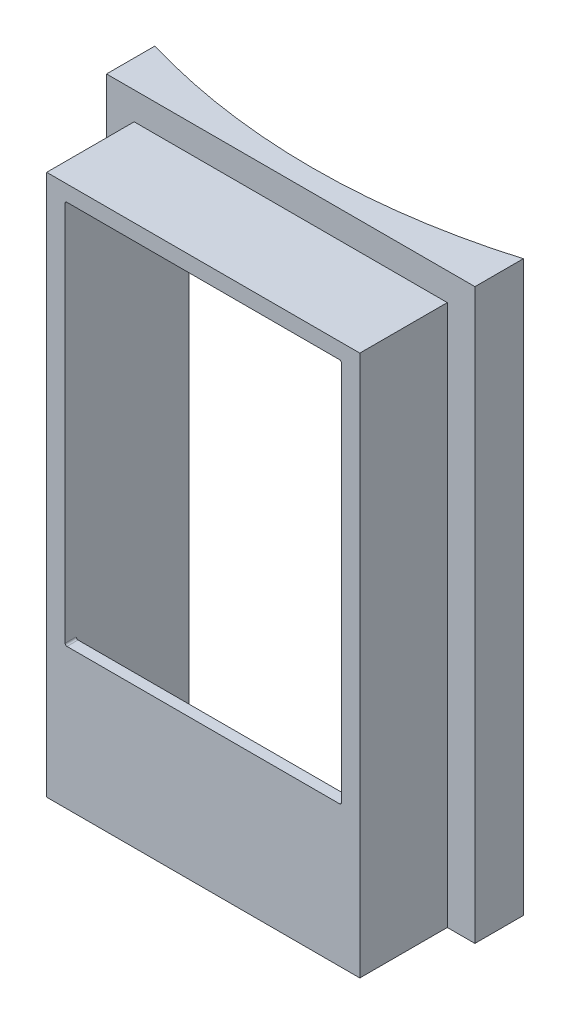
ISO-10303-21;
HEADER;
FILE_DESCRIPTION(('STEP AP214'),'2;1');
FILE_NAME('part.step','',(''),(''),'','','');
FILE_SCHEMA(('AUTOMOTIVE_DESIGN { 1 0 10303 214 1 1 1 1 }'));
ENDSEC;
DATA;
#1=APPLICATION_CONTEXT('core data for automotive mechanical design processes');
#2=APPLICATION_PROTOCOL_DEFINITION('international standard','automotive_design',2000,#1);
#3=PRODUCT_CONTEXT('',#1,'mechanical');
#4=PRODUCT('Part','Part','',(#3));
#5=PRODUCT_RELATED_PRODUCT_CATEGORY('part','',(#4));
#6=PRODUCT_DEFINITION_FORMATION('','',#4);
#7=PRODUCT_DEFINITION_CONTEXT('part definition',#1,'design');
#8=PRODUCT_DEFINITION('design','',#6,#7);
#9=PRODUCT_DEFINITION_SHAPE('','',#8);
#10=(LENGTH_UNIT() NAMED_UNIT(*) SI_UNIT(.MILLI.,.METRE.));
#11=(NAMED_UNIT(*) PLANE_ANGLE_UNIT() SI_UNIT($,.RADIAN.));
#12=(NAMED_UNIT(*) SI_UNIT($,.STERADIAN.) SOLID_ANGLE_UNIT());
#13=UNCERTAINTY_MEASURE_WITH_UNIT(LENGTH_MEASURE(1.E-05),#10,'distance_accuracy_value','');
#14=(GEOMETRIC_REPRESENTATION_CONTEXT(3) GLOBAL_UNCERTAINTY_ASSIGNED_CONTEXT((#13)) GLOBAL_UNIT_ASSIGNED_CONTEXT((#10,
#11,#12)) REPRESENTATION_CONTEXT('',''));
#15=CARTESIAN_POINT('',(0.,0.,0.));
#16=DIRECTION('',(0.,0.,1.));
#17=DIRECTION('',(1.,0.,0.));
#18=AXIS2_PLACEMENT_3D('',#15,#16,#17);
#19=CARTESIAN_POINT('',(-47.625,-51.689,324.1802));
#20=DIRECTION('',(0.,1.,0.));
#21=DIRECTION('',(0.,0.,1.));
#22=AXIS2_PLACEMENT_3D('',#19,#20,#21);
#23=PLANE('',#22);
#24=DIRECTION('',(1.,0.,0.));
#25=VECTOR('',#24,1.);
#26=CARTESIAN_POINT('',(47.625,-51.689,256.54));
#27=LINE('',#26,#25);
#28=CARTESIAN_POINT('',(-46.99,-51.689,256.54));
#29=VERTEX_POINT('',#28);
#30=CARTESIAN_POINT('',(46.99,-51.689,256.54));
#31=VERTEX_POINT('',#30);
#32=EDGE_CURVE('E269',#29,#31,#27,.T.);
#33=ORIENTED_EDGE('',*,*,#32,.F.);
#34=DIRECTION('',(0.,0.,-1.));
#35=VECTOR('',#34,1.);
#36=CARTESIAN_POINT('',(-46.99,-51.689,260.35254));
#37=LINE('',#36,#35);
#38=CARTESIAN_POINT('',(-46.99,-51.689,260.35254));
#39=VERTEX_POINT('',#38);
#40=EDGE_CURVE('E49',#29,#39,#37,.F.);
#41=ORIENTED_EDGE('',*,*,#40,.T.);
#42=DIRECTION('',(-1.,0.,0.));
#43=VECTOR('',#42,1.);
#44=CARTESIAN_POINT('',(-53.975,-51.689,260.35254));
#45=LINE('',#44,#43);
#46=CARTESIAN_POINT('',(46.99,-51.689,260.35254));
#47=VERTEX_POINT('',#46);
#48=EDGE_CURVE('E692',#47,#39,#45,.T.);
#49=ORIENTED_EDGE('',*,*,#48,.F.);
#50=DIRECTION('',(0.,0.,-1.));
#51=VECTOR('',#50,1.);
#52=CARTESIAN_POINT('',(46.99,-51.689,256.54));
#53=LINE('',#52,#51);
#54=EDGE_CURVE('E673',#47,#31,#53,.T.);
#55=ORIENTED_EDGE('',*,*,#54,.T.);
#56=EDGE_LOOP('',(#33,#41,#49,#55));
#57=FACE_BOUND('',#56,.T.);
#58=ADVANCED_FACE('F34',(#57),#23,.T.);
#59=CARTESIAN_POINT('',(-53.975,-100.203,260.35254));
#60=DIRECTION('',(0.,0.,1.));
#61=DIRECTION('',(1.,0.,0.));
#62=AXIS2_PLACEMENT_3D('',#59,#60,#61);
#63=PLANE('',#62);
#64=DIRECTION('',(0.,-1.,0.));
#65=VECTOR('',#64,1.);
#66=CARTESIAN_POINT('',(-53.975,86.36,260.35254));
#67=LINE('',#66,#65);
#68=CARTESIAN_POINT('',(-53.975,86.36,260.35254));
#69=VERTEX_POINT('',#68);
#70=CARTESIAN_POINT('',(-53.975,-100.203,260.35254));
#71=VERTEX_POINT('',#70);
#72=EDGE_CURVE('E279',#69,#71,#67,.T.);
#73=ORIENTED_EDGE('',*,*,#72,.T.);
#74=DIRECTION('',(1.,0.,0.));
#75=VECTOR('',#74,1.);
#76=CARTESIAN_POINT('',(-53.975,-100.203,260.35254));
#77=LINE('',#76,#75);
#78=CARTESIAN_POINT('',(53.975,-100.203,260.35254));
#79=VERTEX_POINT('',#78);
#80=EDGE_CURVE('E325',#71,#79,#77,.T.);
#81=ORIENTED_EDGE('',*,*,#80,.T.);
#82=DIRECTION('',(0.,1.,0.));
#83=VECTOR('',#82,1.);
#84=CARTESIAN_POINT('',(53.975,86.36,260.35254));
#85=LINE('',#84,#83);
#86=CARTESIAN_POINT('',(53.975,86.36,260.35254));
#87=VERTEX_POINT('',#86);
#88=EDGE_CURVE('E292',#79,#87,#85,.T.);
#89=ORIENTED_EDGE('',*,*,#88,.T.);
#90=DIRECTION('',(-1.,0.,0.));
#91=VECTOR('',#90,1.);
#92=CARTESIAN_POINT('',(-53.975,86.36,260.35254));
#93=LINE('',#92,#91);
#94=EDGE_CURVE('E274',#87,#69,#93,.T.);
#95=ORIENTED_EDGE('',*,*,#94,.T.);
#96=EDGE_LOOP('',(#73,#81,#89,#95));
#97=FACE_BOUND('',#96,.T.);
#98=DIRECTION('',(0.,-1.,0.));
#99=VECTOR('',#98,1.);
#100=CARTESIAN_POINT('',(47.625,-100.203,260.35254));
#101=LINE('',#100,#99);
#102=CARTESIAN_POINT('',(47.625,80.264,260.35254));
#103=VERTEX_POINT('',#102);
#104=CARTESIAN_POINT('',(47.625,-51.054,260.35254));
#105=VERTEX_POINT('',#104);
#106=EDGE_CURVE('E695',#103,#105,#101,.T.);
#107=ORIENTED_EDGE('',*,*,#106,.T.);
#108=CARTESIAN_POINT('',(46.99,-51.054,260.35254));
#109=DIRECTION('',(0.,0.,1.));
#110=DIRECTION('',(1.,0.,0.));
#111=AXIS2_PLACEMENT_3D('',#108,#109,#110);
#112=CIRCLE('',#111,0.635);
#113=EDGE_CURVE('E11',#105,#47,#112,.F.);
#114=ORIENTED_EDGE('',*,*,#113,.T.);
#115=ORIENTED_EDGE('',*,*,#48,.T.);
#116=CARTESIAN_POINT('',(-46.99,-51.054,260.35254));
#117=DIRECTION('',(0.,0.,1.));
#118=DIRECTION('',(1.,0.,0.));
#119=AXIS2_PLACEMENT_3D('',#116,#117,#118);
#120=CIRCLE('',#119,0.635);
#121=CARTESIAN_POINT('',(-47.625,-51.054,260.35254));
#122=VERTEX_POINT('',#121);
#123=EDGE_CURVE('E688',#39,#122,#120,.F.);
#124=ORIENTED_EDGE('',*,*,#123,.T.);
#125=DIRECTION('',(0.,1.,0.));
#126=VECTOR('',#125,1.);
#127=CARTESIAN_POINT('',(-47.625,-100.203,260.35254));
#128=LINE('',#127,#126);
#129=CARTESIAN_POINT('',(-47.625,80.264,260.35254));
#130=VERTEX_POINT('',#129);
#131=EDGE_CURVE('E694',#122,#130,#128,.T.);
#132=ORIENTED_EDGE('',*,*,#131,.T.);
#133=CARTESIAN_POINT('',(-46.99,80.264,260.35254));
#134=DIRECTION('',(0.,0.,1.));
#135=DIRECTION('',(1.,0.,0.));
#136=AXIS2_PLACEMENT_3D('',#133,#134,#135);
#137=CIRCLE('',#136,0.635);
#138=CARTESIAN_POINT('',(-46.99,80.899,260.35254));
#139=VERTEX_POINT('',#138);
#140=EDGE_CURVE('E684',#130,#139,#137,.F.);
#141=ORIENTED_EDGE('',*,*,#140,.T.);
#142=DIRECTION('',(1.,0.,0.));
#143=VECTOR('',#142,1.);
#144=CARTESIAN_POINT('',(-53.975,80.899,260.35254));
#145=LINE('',#144,#143);
#146=CARTESIAN_POINT('',(46.99,80.899,260.35254));
#147=VERTEX_POINT('',#146);
#148=EDGE_CURVE('E230',#139,#147,#145,.T.);
#149=ORIENTED_EDGE('',*,*,#148,.T.);
#150=CARTESIAN_POINT('',(46.99,80.264,260.35254));
#151=DIRECTION('',(0.,0.,1.));
#152=DIRECTION('',(1.,0.,0.));
#153=AXIS2_PLACEMENT_3D('',#150,#151,#152);
#154=CIRCLE('',#153,0.635);
#155=EDGE_CURVE('E679',#147,#103,#154,.F.);
#156=ORIENTED_EDGE('',*,*,#155,.T.);
#157=EDGE_LOOP('',(#107,#114,#115,#124,#132,#141,#149,#156));
#158=FACE_BOUND('',#157,.T.);
#159=ADVANCED_FACE('F327',(#97,#158),#63,.T.);
#160=CARTESIAN_POINT('',(-63.5,95.885,230.2002));
#161=DIRECTION('',(1.,0.,0.));
#162=DIRECTION('',(0.,1.,0.));
#163=AXIS2_PLACEMENT_3D('',#160,#161,#162);
#164=PLANE('',#163);
#165=DIRECTION('',(0.,0.,-1.));
#166=VECTOR('',#165,1.);
#167=CARTESIAN_POINT('',(-63.5,95.885,230.2002));
#168=LINE('',#167,#166);
#169=CARTESIAN_POINT('',(-63.5,95.885,230.2002));
#170=VERTEX_POINT('',#169);
#171=CARTESIAN_POINT('',(-63.5,95.885,213.515518321269));
#172=VERTEX_POINT('',#171);
#173=EDGE_CURVE('E221',#170,#172,#168,.T.);
#174=ORIENTED_EDGE('',*,*,#173,.T.);
#175=DIRECTION('',(0.,1.,0.));
#176=VECTOR('',#175,1.);
#177=CARTESIAN_POINT('',(-63.5,-106.975,213.515518321269));
#178=LINE('',#177,#176);
#179=CARTESIAN_POINT('',(-63.5,-100.203,213.515518321269));
#180=VERTEX_POINT('',#179);
#181=EDGE_CURVE('E200',#172,#180,#178,.F.);
#182=ORIENTED_EDGE('',*,*,#181,.T.);
#183=DIRECTION('',(0.,0.,-1.));
#184=VECTOR('',#183,1.);
#185=CARTESIAN_POINT('',(-63.5,-100.203,230.2002));
#186=LINE('',#185,#184);
#187=CARTESIAN_POINT('',(-63.5,-100.203,230.2002));
#188=VERTEX_POINT('',#187);
#189=EDGE_CURVE('E223',#188,#180,#186,.T.);
#190=ORIENTED_EDGE('',*,*,#189,.F.);
#191=DIRECTION('',(0.,-1.,0.));
#192=VECTOR('',#191,1.);
#193=CARTESIAN_POINT('',(-63.5,95.885,230.2002));
#194=LINE('',#193,#192);
#195=EDGE_CURVE('E240',#170,#188,#194,.T.);
#196=ORIENTED_EDGE('',*,*,#195,.F.);
#197=EDGE_LOOP('',(#174,#182,#190,#196));
#198=FACE_BOUND('',#197,.T.);
#199=ADVANCED_FACE('F249',(#198),#164,.F.);
#200=CARTESIAN_POINT('',(-63.5,-100.203,230.2002));
#201=DIRECTION('',(0.,1.,0.));
#202=DIRECTION('',(0.,0.,1.));
#203=AXIS2_PLACEMENT_3D('',#200,#201,#202);
#204=PLANE('',#203);
#205=ORIENTED_EDGE('',*,*,#189,.T.);
#206=CARTESIAN_POINT('',(0.,-100.203,0.));
#207=DIRECTION('',(0.,1.,0.));
#208=DIRECTION('',(0.,0.,1.));
#209=AXIS2_PLACEMENT_3D('',#206,#207,#208);
#210=CIRCLE('',#209,222.758);
#211=CARTESIAN_POINT('',(63.5,-100.203,213.515518321269));
#212=VERTEX_POINT('',#211);
#213=EDGE_CURVE('E216',#180,#212,#210,.T.);
#214=ORIENTED_EDGE('',*,*,#213,.T.);
#215=DIRECTION('',(0.,0.,-1.));
#216=VECTOR('',#215,1.);
#217=CARTESIAN_POINT('',(63.5,-100.203,230.2002));
#218=LINE('',#217,#216);
#219=CARTESIAN_POINT('',(63.5,-100.203,230.2002));
#220=VERTEX_POINT('',#219);
#221=EDGE_CURVE('E215',#220,#212,#218,.T.);
#222=ORIENTED_EDGE('',*,*,#221,.F.);
#223=DIRECTION('',(1.,0.,0.));
#224=VECTOR('',#223,1.);
#225=CARTESIAN_POINT('',(-63.5,-100.203,230.2002));
#226=LINE('',#225,#224);
#227=CARTESIAN_POINT('',(53.975,-100.203,230.2002));
#228=VERTEX_POINT('',#227);
#229=EDGE_CURVE('E235',#228,#220,#226,.T.);
#230=ORIENTED_EDGE('',*,*,#229,.F.);
#231=DIRECTION('',(0.,0.,-1.));
#232=VECTOR('',#231,1.);
#233=CARTESIAN_POINT('',(53.975,-100.203,260.35254));
#234=LINE('',#233,#232);
#235=EDGE_CURVE('E252',#79,#228,#234,.T.);
#236=ORIENTED_EDGE('',*,*,#235,.F.);
#237=ORIENTED_EDGE('',*,*,#80,.F.);
#238=DIRECTION('',(0.,0.,-1.));
#239=VECTOR('',#238,1.);
#240=CARTESIAN_POINT('',(-53.975,-100.203,260.35254));
#241=LINE('',#240,#239);
#242=CARTESIAN_POINT('',(-53.975,-100.203,230.2002));
#243=VERTEX_POINT('',#242);
#244=EDGE_CURVE('E250',#71,#243,#241,.T.);
#245=ORIENTED_EDGE('',*,*,#244,.T.);
#246=EDGE_CURVE('E231',#188,#243,#226,.T.);
#247=ORIENTED_EDGE('',*,*,#246,.F.);
#248=EDGE_LOOP('',(#205,#214,#222,#230,#236,#237,#245,#247));
#249=FACE_BOUND('',#248,.T.);
#250=ADVANCED_FACE('F297',(#249),#204,.F.);
#251=CARTESIAN_POINT('',(63.5,95.885,230.2002));
#252=DIRECTION('',(-1.,0.,0.));
#253=DIRECTION('',(0.,-1.,0.));
#254=AXIS2_PLACEMENT_3D('',#251,#252,#253);
#255=PLANE('',#254);
#256=ORIENTED_EDGE('',*,*,#221,.T.);
#257=DIRECTION('',(0.,1.,0.));
#258=VECTOR('',#257,1.);
#259=CARTESIAN_POINT('',(63.5,-106.975,213.515518321269));
#260=LINE('',#259,#258);
#261=CARTESIAN_POINT('',(63.5,95.885,213.515518321269));
#262=VERTEX_POINT('',#261);
#263=EDGE_CURVE('E197',#212,#262,#260,.T.);
#264=ORIENTED_EDGE('',*,*,#263,.T.);
#265=DIRECTION('',(0.,0.,-1.));
#266=VECTOR('',#265,1.);
#267=CARTESIAN_POINT('',(63.5,95.885,230.2002));
#268=LINE('',#267,#266);
#269=CARTESIAN_POINT('',(63.5,95.885,230.2002));
#270=VERTEX_POINT('',#269);
#271=EDGE_CURVE('E212',#270,#262,#268,.T.);
#272=ORIENTED_EDGE('',*,*,#271,.F.);
#273=DIRECTION('',(0.,1.,0.));
#274=VECTOR('',#273,1.);
#275=CARTESIAN_POINT('',(63.5,95.885,230.2002));
#276=LINE('',#275,#274);
#277=EDGE_CURVE('E234',#220,#270,#276,.T.);
#278=ORIENTED_EDGE('',*,*,#277,.F.);
#279=EDGE_LOOP('',(#256,#264,#272,#278));
#280=FACE_BOUND('',#279,.T.);
#281=ADVANCED_FACE('F210',(#280),#255,.F.);
#282=CARTESIAN_POINT('',(-63.5,95.885,230.2002));
#283=DIRECTION('',(0.,-1.,0.));
#284=DIRECTION('',(0.,0.,-1.));
#285=AXIS2_PLACEMENT_3D('',#282,#283,#284);
#286=PLANE('',#285);
#287=ORIENTED_EDGE('',*,*,#271,.T.);
#288=CARTESIAN_POINT('',(0.,95.885,0.));
#289=DIRECTION('',(0.,1.,0.));
#290=DIRECTION('',(0.,0.,1.));
#291=AXIS2_PLACEMENT_3D('',#288,#289,#290);
#292=CIRCLE('',#291,222.758);
#293=EDGE_CURVE('E194',#172,#262,#292,.T.);
#294=ORIENTED_EDGE('',*,*,#293,.F.);
#295=ORIENTED_EDGE('',*,*,#173,.F.);
#296=DIRECTION('',(-1.,0.,0.));
#297=VECTOR('',#296,1.);
#298=CARTESIAN_POINT('',(-63.5,95.885,230.2002));
#299=LINE('',#298,#297);
#300=EDGE_CURVE('E220',#270,#170,#299,.T.);
#301=ORIENTED_EDGE('',*,*,#300,.F.);
#302=EDGE_LOOP('',(#287,#294,#295,#301));
#303=FACE_BOUND('',#302,.T.);
#304=ADVANCED_FACE('F219',(#303),#286,.F.);
#305=CARTESIAN_POINT('',(-63.5,-100.203,230.2002));
#306=DIRECTION('',(0.,0.,1.));
#307=DIRECTION('',(1.,0.,0.));
#308=AXIS2_PLACEMENT_3D('',#305,#306,#307);
#309=PLANE('',#308);
#310=DIRECTION('',(0.,-1.,0.));
#311=VECTOR('',#310,1.);
#312=CARTESIAN_POINT('',(-53.975,86.36,230.2002));
#313=LINE('',#312,#311);
#314=CARTESIAN_POINT('',(-53.975,86.36,230.2002));
#315=VERTEX_POINT('',#314);
#316=EDGE_CURVE('E265',#315,#243,#313,.T.);
#317=ORIENTED_EDGE('',*,*,#316,.F.);
#318=DIRECTION('',(-1.,0.,0.));
#319=VECTOR('',#318,1.);
#320=CARTESIAN_POINT('',(-53.975,86.36,230.2002));
#321=LINE('',#320,#319);
#322=CARTESIAN_POINT('',(53.975,86.36,230.2002));
#323=VERTEX_POINT('',#322);
#324=EDGE_CURVE('E276',#323,#315,#321,.T.);
#325=ORIENTED_EDGE('',*,*,#324,.F.);
#326=DIRECTION('',(0.,1.,0.));
#327=VECTOR('',#326,1.);
#328=CARTESIAN_POINT('',(53.975,86.36,230.2002));
#329=LINE('',#328,#327);
#330=EDGE_CURVE('E268',#228,#323,#329,.T.);
#331=ORIENTED_EDGE('',*,*,#330,.F.);
#332=ORIENTED_EDGE('',*,*,#229,.T.);
#333=ORIENTED_EDGE('',*,*,#277,.T.);
#334=ORIENTED_EDGE('',*,*,#300,.T.);
#335=ORIENTED_EDGE('',*,*,#195,.T.);
#336=ORIENTED_EDGE('',*,*,#246,.T.);
#337=EDGE_LOOP('',(#317,#325,#331,#332,#333,#334,#335,#336));
#338=FACE_BOUND('',#337,.T.);
#339=ADVANCED_FACE('F245',(#338),#309,.T.);
#340=CARTESIAN_POINT('',(-53.975,86.36,260.35254));
#341=DIRECTION('',(1.,0.,0.));
#342=DIRECTION('',(0.,1.,0.));
#343=AXIS2_PLACEMENT_3D('',#340,#341,#342);
#344=PLANE('',#343);
#345=ORIENTED_EDGE('',*,*,#316,.T.);
#346=ORIENTED_EDGE('',*,*,#244,.F.);
#347=ORIENTED_EDGE('',*,*,#72,.F.);
#348=DIRECTION('',(0.,0.,-1.));
#349=VECTOR('',#348,1.);
#350=CARTESIAN_POINT('',(-53.975,86.36,260.35254));
#351=LINE('',#350,#349);
#352=EDGE_CURVE('E280',#69,#315,#351,.T.);
#353=ORIENTED_EDGE('',*,*,#352,.T.);
#354=EDGE_LOOP('',(#345,#346,#347,#353));
#355=FACE_BOUND('',#354,.T.);
#356=ADVANCED_FACE('F330',(#355),#344,.F.);
#357=CARTESIAN_POINT('',(53.975,86.36,260.35254));
#358=DIRECTION('',(-1.,0.,0.));
#359=DIRECTION('',(0.,-1.,0.));
#360=AXIS2_PLACEMENT_3D('',#357,#358,#359);
#361=PLANE('',#360);
#362=ORIENTED_EDGE('',*,*,#330,.T.);
#363=DIRECTION('',(0.,0.,-1.));
#364=VECTOR('',#363,1.);
#365=CARTESIAN_POINT('',(53.975,86.36,260.35254));
#366=LINE('',#365,#364);
#367=EDGE_CURVE('E258',#87,#323,#366,.T.);
#368=ORIENTED_EDGE('',*,*,#367,.F.);
#369=ORIENTED_EDGE('',*,*,#88,.F.);
#370=ORIENTED_EDGE('',*,*,#235,.T.);
#371=EDGE_LOOP('',(#362,#368,#369,#370));
#372=FACE_BOUND('',#371,.T.);
#373=ADVANCED_FACE('F291',(#372),#361,.F.);
#374=CARTESIAN_POINT('',(-53.975,86.36,260.35254));
#375=DIRECTION('',(0.,-1.,0.));
#376=DIRECTION('',(0.,0.,-1.));
#377=AXIS2_PLACEMENT_3D('',#374,#375,#376);
#378=PLANE('',#377);
#379=ORIENTED_EDGE('',*,*,#324,.T.);
#380=ORIENTED_EDGE('',*,*,#352,.F.);
#381=ORIENTED_EDGE('',*,*,#94,.F.);
#382=ORIENTED_EDGE('',*,*,#367,.T.);
#383=EDGE_LOOP('',(#379,#380,#381,#382));
#384=FACE_BOUND('',#383,.T.);
#385=ADVANCED_FACE('F286',(#384),#378,.F.);
#386=CARTESIAN_POINT('',(-47.625,80.899,324.1802));
#387=DIRECTION('',(1.,0.,0.));
#388=DIRECTION('',(0.,1.,0.));
#389=AXIS2_PLACEMENT_3D('',#386,#387,#388);
#390=PLANE('',#389);
#391=DIRECTION('',(0.,1.,0.));
#392=VECTOR('',#391,1.);
#393=CARTESIAN_POINT('',(-47.625,80.899,256.54));
#394=LINE('',#393,#392);
#395=CARTESIAN_POINT('',(-47.625,80.264,256.54));
#396=VERTEX_POINT('',#395);
#397=CARTESIAN_POINT('',(-47.625,81.28,256.54));
#398=VERTEX_POINT('',#397);
#399=EDGE_CURVE('E307',#396,#398,#394,.T.);
#400=ORIENTED_EDGE('',*,*,#399,.F.);
#401=DIRECTION('',(0.,0.,-1.));
#402=VECTOR('',#401,1.);
#403=CARTESIAN_POINT('',(-47.625,80.264,260.35254));
#404=LINE('',#403,#402);
#405=EDGE_CURVE('E671',#396,#130,#404,.F.);
#406=ORIENTED_EDGE('',*,*,#405,.T.);
#407=ORIENTED_EDGE('',*,*,#131,.F.);
#408=DIRECTION('',(0.,0.,-1.));
#409=VECTOR('',#408,1.);
#410=CARTESIAN_POINT('',(-47.625,-51.054,256.54));
#411=LINE('',#410,#409);
#412=CARTESIAN_POINT('',(-47.625,-51.054,256.54));
#413=VERTEX_POINT('',#412);
#414=EDGE_CURVE('E669',#122,#413,#411,.T.);
#415=ORIENTED_EDGE('',*,*,#414,.T.);
#416=DIRECTION('',(0.,1.,0.));
#417=VECTOR('',#416,1.);
#418=CARTESIAN_POINT('',(-47.625,-51.689,256.54));
#419=LINE('',#418,#417);
#420=CARTESIAN_POINT('',(-47.625,-95.123,256.54));
#421=VERTEX_POINT('',#420);
#422=EDGE_CURVE('E319',#421,#413,#419,.T.);
#423=ORIENTED_EDGE('',*,*,#422,.F.);
#424=DIRECTION('',(0.,0.,-1.));
#425=VECTOR('',#424,1.);
#426=CARTESIAN_POINT('',(-47.625,-95.123,324.1802));
#427=LINE('',#426,#425);
#428=CARTESIAN_POINT('',(-47.625,-95.123,217.607412417408));
#429=VERTEX_POINT('',#428);
#430=EDGE_CURVE('E626',#421,#429,#427,.T.);
#431=ORIENTED_EDGE('',*,*,#430,.T.);
#432=DIRECTION('',(0.,1.,0.));
#433=VECTOR('',#432,1.);
#434=CARTESIAN_POINT('',(-47.625,-106.975,217.607412417408));
#435=LINE('',#434,#433);
#436=CARTESIAN_POINT('',(-47.625,81.28,217.607412417408));
#437=VERTEX_POINT('',#436);
#438=EDGE_CURVE('E589',#437,#429,#435,.F.);
#439=ORIENTED_EDGE('',*,*,#438,.F.);
#440=DIRECTION('',(0.,0.,-1.));
#441=VECTOR('',#440,1.);
#442=CARTESIAN_POINT('',(-47.625,81.28,324.1802));
#443=LINE('',#442,#441);
#444=EDGE_CURVE('E631',#437,#398,#443,.F.);
#445=ORIENTED_EDGE('',*,*,#444,.T.);
#446=EDGE_LOOP('',(#400,#406,#407,#415,#423,#431,#439,#445));
#447=FACE_BOUND('',#446,.T.);
#448=ADVANCED_FACE('F349',(#447),#390,.T.);
#449=CARTESIAN_POINT('',(47.625,80.899,324.1802));
#450=DIRECTION('',(-1.,0.,0.));
#451=DIRECTION('',(0.,-1.,0.));
#452=AXIS2_PLACEMENT_3D('',#449,#450,#451);
#453=PLANE('',#452);
#454=ORIENTED_EDGE('',*,*,#106,.F.);
#455=DIRECTION('',(0.,0.,-1.));
#456=VECTOR('',#455,1.);
#457=CARTESIAN_POINT('',(47.625,80.264,256.54));
#458=LINE('',#457,#456);
#459=CARTESIAN_POINT('',(47.625,80.264,256.54));
#460=VERTEX_POINT('',#459);
#461=EDGE_CURVE('E658',#103,#460,#458,.T.);
#462=ORIENTED_EDGE('',*,*,#461,.T.);
#463=DIRECTION('',(0.,-1.,0.));
#464=VECTOR('',#463,1.);
#465=CARTESIAN_POINT('',(47.625,80.899,256.54));
#466=LINE('',#465,#464);
#467=CARTESIAN_POINT('',(47.625,81.28,256.54));
#468=VERTEX_POINT('',#467);
#469=EDGE_CURVE('E299',#468,#460,#466,.T.);
#470=ORIENTED_EDGE('',*,*,#469,.F.);
#471=DIRECTION('',(0.,0.,-1.));
#472=VECTOR('',#471,1.);
#473=CARTESIAN_POINT('',(47.625,81.28,324.1802));
#474=LINE('',#473,#472);
#475=CARTESIAN_POINT('',(47.625,81.28,217.607412417408));
#476=VERTEX_POINT('',#475);
#477=EDGE_CURVE('E645',#468,#476,#474,.T.);
#478=ORIENTED_EDGE('',*,*,#477,.T.);
#479=DIRECTION('',(0.,1.,0.));
#480=VECTOR('',#479,1.);
#481=CARTESIAN_POINT('',(47.625,-106.975,217.607412417408));
#482=LINE('',#481,#480);
#483=CARTESIAN_POINT('',(47.625,-95.123,217.607412417408));
#484=VERTEX_POINT('',#483);
#485=EDGE_CURVE('E628',#484,#476,#482,.T.);
#486=ORIENTED_EDGE('',*,*,#485,.F.);
#487=DIRECTION('',(0.,0.,-1.));
#488=VECTOR('',#487,1.);
#489=CARTESIAN_POINT('',(47.625,-95.123,324.1802));
#490=LINE('',#489,#488);
#491=CARTESIAN_POINT('',(47.625,-95.123,256.54));
#492=VERTEX_POINT('',#491);
#493=EDGE_CURVE('E643',#484,#492,#490,.F.);
#494=ORIENTED_EDGE('',*,*,#493,.T.);
#495=DIRECTION('',(0.,-1.,0.));
#496=VECTOR('',#495,1.);
#497=CARTESIAN_POINT('',(47.625,-51.689,256.54));
#498=LINE('',#497,#496);
#499=CARTESIAN_POINT('',(47.625,-51.054,256.54));
#500=VERTEX_POINT('',#499);
#501=EDGE_CURVE('E313',#500,#492,#498,.T.);
#502=ORIENTED_EDGE('',*,*,#501,.F.);
#503=DIRECTION('',(0.,0.,-1.));
#504=VECTOR('',#503,1.);
#505=CARTESIAN_POINT('',(47.625,-51.054,260.35254));
#506=LINE('',#505,#504);
#507=EDGE_CURVE('E655',#500,#105,#506,.F.);
#508=ORIENTED_EDGE('',*,*,#507,.T.);
#509=EDGE_LOOP('',(#454,#462,#470,#478,#486,#494,#502,#508));
#510=FACE_BOUND('',#509,.T.);
#511=ADVANCED_FACE('F347',(#510),#453,.T.);
#512=CARTESIAN_POINT('',(-47.625,80.899,324.1802));
#513=DIRECTION('',(0.,-1.,0.));
#514=DIRECTION('',(0.,0.,-1.));
#515=AXIS2_PLACEMENT_3D('',#512,#513,#514);
#516=PLANE('',#515);
#517=DIRECTION('',(-1.,0.,0.));
#518=VECTOR('',#517,1.);
#519=CARTESIAN_POINT('',(47.625,80.899,256.54));
#520=LINE('',#519,#518);
#521=CARTESIAN_POINT('',(46.99,80.899,256.54));
#522=VERTEX_POINT('',#521);
#523=CARTESIAN_POINT('',(-46.99,80.899,256.54));
#524=VERTEX_POINT('',#523);
#525=EDGE_CURVE('E304',#522,#524,#520,.T.);
#526=ORIENTED_EDGE('',*,*,#525,.F.);
#527=DIRECTION('',(0.,0.,-1.));
#528=VECTOR('',#527,1.);
#529=CARTESIAN_POINT('',(46.99,80.899,260.35254));
#530=LINE('',#529,#528);
#531=EDGE_CURVE('E667',#522,#147,#530,.F.);
#532=ORIENTED_EDGE('',*,*,#531,.T.);
#533=ORIENTED_EDGE('',*,*,#148,.F.);
#534=DIRECTION('',(0.,0.,-1.));
#535=VECTOR('',#534,1.);
#536=CARTESIAN_POINT('',(-46.99,80.899,256.54));
#537=LINE('',#536,#535);
#538=EDGE_CURVE('E662',#139,#524,#537,.T.);
#539=ORIENTED_EDGE('',*,*,#538,.T.);
#540=EDGE_LOOP('',(#526,#532,#533,#539));
#541=FACE_BOUND('',#540,.T.);
#542=ADVANCED_FACE('F370',(#541),#516,.T.);
#543=CARTESIAN_POINT('',(47.625,-97.663,256.54));
#544=DIRECTION('',(0.,-1.,0.));
#545=DIRECTION('',(0.,0.,-1.));
#546=AXIS2_PLACEMENT_3D('',#543,#544,#545);
#547=PLANE('',#546);
#548=DIRECTION('',(0.,0.,-1.));
#549=VECTOR('',#548,1.);
#550=CARTESIAN_POINT('',(45.085,-97.663,256.54));
#551=LINE('',#550,#549);
#552=CARTESIAN_POINT('',(45.085,-97.663,256.54));
#553=VERTEX_POINT('',#552);
#554=CARTESIAN_POINT('',(45.085,-97.663,218.147815343175));
#555=VERTEX_POINT('',#554);
#556=EDGE_CURVE('E648',#553,#555,#551,.T.);
#557=ORIENTED_EDGE('',*,*,#556,.T.);
#558=CARTESIAN_POINT('',(0.,-97.663,0.));
#559=DIRECTION('',(0.,-1.,0.));
#560=DIRECTION('',(0.,0.,-1.));
#561=AXIS2_PLACEMENT_3D('',#558,#559,#560);
#562=CIRCLE('',#561,222.758);
#563=CARTESIAN_POINT('',(-45.085,-97.663,218.147815343175));
#564=VERTEX_POINT('',#563);
#565=EDGE_CURVE('E205',#555,#564,#562,.T.);
#566=ORIENTED_EDGE('',*,*,#565,.T.);
#567=DIRECTION('',(0.,0.,-1.));
#568=VECTOR('',#567,1.);
#569=CARTESIAN_POINT('',(-45.085,-97.663,256.54));
#570=LINE('',#569,#568);
#571=CARTESIAN_POINT('',(-45.085,-97.663,256.54));
#572=VERTEX_POINT('',#571);
#573=EDGE_CURVE('E627',#564,#572,#570,.F.);
#574=ORIENTED_EDGE('',*,*,#573,.T.);
#575=DIRECTION('',(-1.,0.,0.));
#576=VECTOR('',#575,1.);
#577=CARTESIAN_POINT('',(47.625,-97.663,256.54));
#578=LINE('',#577,#576);
#579=EDGE_CURVE('E316',#553,#572,#578,.T.);
#580=ORIENTED_EDGE('',*,*,#579,.F.);
#581=EDGE_LOOP('',(#557,#566,#574,#580));
#582=FACE_BOUND('',#581,.T.);
#583=ADVANCED_FACE('F377',(#582),#547,.F.);
#584=CARTESIAN_POINT('',(47.625,-97.663,256.54));
#585=DIRECTION('',(0.,0.,-1.));
#586=DIRECTION('',(-1.,0.,0.));
#587=AXIS2_PLACEMENT_3D('',#584,#585,#586);
#588=PLANE('',#587);
#589=ORIENTED_EDGE('',*,*,#579,.T.);
#590=CARTESIAN_POINT('',(-45.085,-95.123,256.54));
#591=DIRECTION('',(0.,0.,-1.));
#592=DIRECTION('',(-1.,0.,0.));
#593=AXIS2_PLACEMENT_3D('',#590,#591,#592);
#594=CIRCLE('',#593,2.54);
#595=EDGE_CURVE('E653',#572,#421,#594,.T.);
#596=ORIENTED_EDGE('',*,*,#595,.T.);
#597=ORIENTED_EDGE('',*,*,#422,.T.);
#598=CARTESIAN_POINT('',(-46.99,-51.054,256.54));
#599=DIRECTION('',(0.,0.,-1.));
#600=DIRECTION('',(-1.,0.,0.));
#601=AXIS2_PLACEMENT_3D('',#598,#599,#600);
#602=CIRCLE('',#601,0.635);
#603=EDGE_CURVE('E686',#413,#29,#602,.F.);
#604=ORIENTED_EDGE('',*,*,#603,.T.);
#605=ORIENTED_EDGE('',*,*,#32,.T.);
#606=CARTESIAN_POINT('',(46.99,-51.054,256.54));
#607=DIRECTION('',(0.,0.,-1.));
#608=DIRECTION('',(-1.,0.,0.));
#609=AXIS2_PLACEMENT_3D('',#606,#607,#608);
#610=CIRCLE('',#609,0.635);
#611=EDGE_CURVE('E42',#31,#500,#610,.F.);
#612=ORIENTED_EDGE('',*,*,#611,.T.);
#613=ORIENTED_EDGE('',*,*,#501,.T.);
#614=CARTESIAN_POINT('',(45.085,-95.123,256.54));
#615=DIRECTION('',(0.,0.,-1.));
#616=DIRECTION('',(-1.,0.,0.));
#617=AXIS2_PLACEMENT_3D('',#614,#615,#616);
#618=CIRCLE('',#617,2.54);
#619=EDGE_CURVE('E652',#492,#553,#618,.T.);
#620=ORIENTED_EDGE('',*,*,#619,.T.);
#621=EDGE_LOOP('',(#589,#596,#597,#604,#605,#612,#613,#620));
#622=FACE_BOUND('',#621,.T.);
#623=ADVANCED_FACE('F385',(#622),#588,.T.);
#624=CARTESIAN_POINT('',(47.625,83.82,256.54));
#625=DIRECTION('',(0.,1.,0.));
#626=DIRECTION('',(0.,0.,1.));
#627=AXIS2_PLACEMENT_3D('',#624,#625,#626);
#628=PLANE('',#627);
#629=DIRECTION('',(0.,0.,-1.));
#630=VECTOR('',#629,1.);
#631=CARTESIAN_POINT('',(-45.085,83.82,256.54));
#632=LINE('',#631,#630);
#633=CARTESIAN_POINT('',(-45.085,83.82,256.54));
#634=VERTEX_POINT('',#633);
#635=CARTESIAN_POINT('',(-45.085,83.82,218.147815343175));
#636=VERTEX_POINT('',#635);
#637=EDGE_CURVE('E632',#634,#636,#632,.T.);
#638=ORIENTED_EDGE('',*,*,#637,.T.);
#639=CARTESIAN_POINT('',(0.,83.82,0.));
#640=DIRECTION('',(0.,1.,0.));
#641=DIRECTION('',(0.,0.,1.));
#642=AXIS2_PLACEMENT_3D('',#639,#640,#641);
#643=CIRCLE('',#642,222.758);
#644=CARTESIAN_POINT('',(45.085,83.82,218.147815343175));
#645=VERTEX_POINT('',#644);
#646=EDGE_CURVE('E614',#636,#645,#643,.T.);
#647=ORIENTED_EDGE('',*,*,#646,.T.);
#648=DIRECTION('',(0.,0.,-1.));
#649=VECTOR('',#648,1.);
#650=CARTESIAN_POINT('',(45.085,83.82,256.54));
#651=LINE('',#650,#649);
#652=CARTESIAN_POINT('',(45.085,83.82,256.54));
#653=VERTEX_POINT('',#652);
#654=EDGE_CURVE('E636',#645,#653,#651,.F.);
#655=ORIENTED_EDGE('',*,*,#654,.T.);
#656=DIRECTION('',(1.,0.,0.));
#657=VECTOR('',#656,1.);
#658=CARTESIAN_POINT('',(47.625,83.82,256.54));
#659=LINE('',#658,#657);
#660=EDGE_CURVE('E310',#634,#653,#659,.T.);
#661=ORIENTED_EDGE('',*,*,#660,.F.);
#662=EDGE_LOOP('',(#638,#647,#655,#661));
#663=FACE_BOUND('',#662,.T.);
#664=ADVANCED_FACE('F394',(#663),#628,.F.);
#665=CARTESIAN_POINT('',(47.625,83.82,256.54));
#666=DIRECTION('',(0.,0.,1.));
#667=DIRECTION('',(1.,0.,0.));
#668=AXIS2_PLACEMENT_3D('',#665,#666,#667);
#669=PLANE('',#668);
#670=ORIENTED_EDGE('',*,*,#399,.T.);
#671=CARTESIAN_POINT('',(-45.085,81.28,256.54));
#672=DIRECTION('',(0.,0.,1.));
#673=DIRECTION('',(1.,0.,0.));
#674=AXIS2_PLACEMENT_3D('',#671,#672,#673);
#675=CIRCLE('',#674,2.54);
#676=EDGE_CURVE('E641',#398,#634,#675,.F.);
#677=ORIENTED_EDGE('',*,*,#676,.T.);
#678=ORIENTED_EDGE('',*,*,#660,.T.);
#679=CARTESIAN_POINT('',(45.085,81.28,256.54));
#680=DIRECTION('',(0.,0.,1.));
#681=DIRECTION('',(1.,0.,0.));
#682=AXIS2_PLACEMENT_3D('',#679,#680,#681);
#683=CIRCLE('',#682,2.54);
#684=EDGE_CURVE('E634',#653,#468,#683,.F.);
#685=ORIENTED_EDGE('',*,*,#684,.T.);
#686=ORIENTED_EDGE('',*,*,#469,.T.);
#687=CARTESIAN_POINT('',(46.99,80.264,256.54));
#688=DIRECTION('',(0.,0.,1.));
#689=DIRECTION('',(1.,0.,0.));
#690=AXIS2_PLACEMENT_3D('',#687,#688,#689);
#691=CIRCLE('',#690,0.635);
#692=EDGE_CURVE('E677',#460,#522,#691,.T.);
#693=ORIENTED_EDGE('',*,*,#692,.T.);
#694=ORIENTED_EDGE('',*,*,#525,.T.);
#695=CARTESIAN_POINT('',(-46.99,80.264,256.54));
#696=DIRECTION('',(0.,0.,1.));
#697=DIRECTION('',(1.,0.,0.));
#698=AXIS2_PLACEMENT_3D('',#695,#696,#697);
#699=CIRCLE('',#698,0.635);
#700=EDGE_CURVE('E681',#524,#396,#699,.T.);
#701=ORIENTED_EDGE('',*,*,#700,.T.);
#702=EDGE_LOOP('',(#670,#677,#678,#685,#686,#693,#694,#701));
#703=FACE_BOUND('',#702,.T.);
#704=ADVANCED_FACE('F402',(#703),#669,.F.);
#705=CARTESIAN_POINT('',(-45.085,81.28,256.54));
#706=DIRECTION('',(0.,0.,-1.));
#707=DIRECTION('',(-1.,0.,0.));
#708=AXIS2_PLACEMENT_3D('',#705,#706,#707);
#709=CYLINDRICAL_SURFACE('',#708,2.54);
#710=ORIENTED_EDGE('',*,*,#444,.F.);
#711=CARTESIAN_POINT('',(-47.625,81.28,217.607412417408));
#712=CARTESIAN_POINT('',(-47.6250077085037,81.3502630373181,217.607410473896));
#713=CARTESIAN_POINT('',(-47.6220845896513,81.4205222819218,217.608050470022));
#714=CARTESIAN_POINT('',(-47.6104361609961,81.5605283696922,217.61059946066));
#715=CARTESIAN_POINT('',(-47.6017114118566,81.6302752617138,217.612508332549));
#716=CARTESIAN_POINT('',(-47.5785355995508,81.7686674620806,217.61757660514));
#717=CARTESIAN_POINT('',(-47.56409266947,81.8373141915428,217.620734229707));
#718=CARTESIAN_POINT('',(-47.5296117977867,81.9730994676427,217.62826763784));
#719=CARTESIAN_POINT('',(-47.5095738717887,82.040238018486,217.632643418008));
#720=CARTESIAN_POINT('',(-47.4412674607836,82.2387157307097,217.647547450258));
#721=CARTESIAN_POINT('',(-47.3847910590903,82.367207455623,217.659855747657));
#722=CARTESIAN_POINT('',(-47.2517889064304,82.612723000592,217.68876775869));
#723=CARTESIAN_POINT('',(-47.1752628332756,82.7297466363197,217.705371541349));
#724=CARTESIAN_POINT('',(-47.0035481577087,82.9504835250709,217.742510319066));
#725=CARTESIAN_POINT('',(-46.9081746614137,83.0540465402254,217.763084209747));
#726=CARTESIAN_POINT('',(-46.7020595550765,83.2437587703921,217.80738116403));
#727=CARTESIAN_POINT('',(-46.5913143045812,83.3299038484509,217.831104973561));
#728=CARTESIAN_POINT('',(-46.3550238472103,83.484312396716,217.881511880907));
#729=CARTESIAN_POINT('',(-46.2292083484335,83.5521444930034,217.908248271415));
#730=CARTESIAN_POINT('',(-45.9683339995435,83.6656953534291,217.963429451579));
#731=CARTESIAN_POINT('',(-45.833277948631,83.7114207806871,217.991873723558));
#732=CARTESIAN_POINT('',(-45.5956254326397,83.7702736474681,218.041683907363));
#733=CARTESIAN_POINT('',(-45.4943121382417,83.7889068248993,218.062846101138));
#734=CARTESIAN_POINT('',(-45.2903494401339,83.8137701537216,218.105299775809));
#735=CARTESIAN_POINT('',(-45.1877020663014,83.8200173330838,218.126591038787));
#736=CARTESIAN_POINT('',(-45.085,83.82,218.147815343175));
#737=B_SPLINE_CURVE_WITH_KNOTS('',3,(#711,#712,#713,#714,#715,#716,#717,#718,#719,#720,#721,
#722,#723,#724,#725,#726,#727,#728,#729,#730,#731,#732,#733,#734,#735,#736),.UNSPECIFIED.,.F.,
.F.,(4,2,2,2,2,2,2,2,2,2,2,2,4),(0.,0.210718724654828,0.421417088643018,0.631816842486876,
0.842216009531028,1.26274227588017,1.68327530029128,2.10815922547127,2.53314394706075,
2.96740541899832,3.40153591946899,3.7163226603718,4.03067633915292),.UNSPECIFIED.);
#738=EDGE_CURVE('E217',#437,#636,#737,.T.);
#739=ORIENTED_EDGE('',*,*,#738,.T.);
#740=ORIENTED_EDGE('',*,*,#637,.F.);
#741=ORIENTED_EDGE('',*,*,#676,.F.);
#742=EDGE_LOOP('',(#710,#739,#740,#741));
#743=FACE_BOUND('',#742,.T.);
#744=ADVANCED_FACE('F410',(#743),#709,.F.);
#745=CARTESIAN_POINT('',(45.085,81.28,324.1802));
#746=DIRECTION('',(0.,0.,-1.));
#747=DIRECTION('',(-1.,0.,0.));
#748=AXIS2_PLACEMENT_3D('',#745,#746,#747);
#749=CYLINDRICAL_SURFACE('',#748,2.54);
#750=ORIENTED_EDGE('',*,*,#654,.F.);
#751=CARTESIAN_POINT('',(45.085,83.82,218.147815343175));
#752=CARTESIAN_POINT('',(45.1576885198745,83.8199986835456,218.132792885577));
#753=CARTESIAN_POINT('',(45.2303346770003,83.8168778893953,218.117740834152));
#754=CARTESIAN_POINT('',(45.3750986648581,83.8044260734775,218.087671448794));
#755=CARTESIAN_POINT('',(45.4472165041311,83.7950951523294,218.072654114303));
#756=CARTESIAN_POINT('',(45.6619612871728,83.7578569137684,218.027826540386));
#757=CARTESIAN_POINT('',(45.8031380939861,83.7207039804035,217.998207943509));
#758=CARTESIAN_POINT('',(46.0773426688328,83.6226688468418,217.940415615903));
#759=CARTESIAN_POINT('',(46.2103651722921,83.5617714996874,217.912242820484));
#760=CARTESIAN_POINT('',(46.4643371914292,83.4178287177179,217.85823093594));
#761=CARTESIAN_POINT('',(46.5852906200958,83.3347904936059,217.832391090696));
#762=CARTESIAN_POINT('',(46.810478764954,83.1495965240246,217.78411056811));
#763=CARTESIAN_POINT('',(46.9148524969812,83.0476172192279,217.761641725303));
#764=CARTESIAN_POINT('',(47.1049473646328,82.82681199602,217.720600725513));
#765=CARTESIAN_POINT('',(47.1906659205984,82.7079837514655,217.702029107456));
#766=CARTESIAN_POINT('',(47.3390752716452,82.4595179886019,217.66980540607));
#767=CARTESIAN_POINT('',(47.40220568816,82.3301548776693,217.656059515095));
#768=CARTESIAN_POINT('',(47.5057801220315,82.0622999063415,217.633476869434));
#769=CARTESIAN_POINT('',(47.5462450339276,81.9238165856325,217.624635593427));
#770=CARTESIAN_POINT('',(47.5914315285406,81.7001759649614,217.614757058648));
#771=CARTESIAN_POINT('',(47.6040125207752,81.6166021964693,217.612004901993));
#772=CARTESIAN_POINT('',(47.6207941597354,81.4486991271753,217.608332914604));
#773=CARTESIAN_POINT('',(47.62500680303,81.3643710822636,217.607410460874));
#774=CARTESIAN_POINT('',(47.625,81.28,217.607412417408));
#775=B_SPLINE_CURVE_WITH_KNOTS('',3,(#751,#752,#753,#754,#755,#756,#757,#758,#759,#760,#761,
#762,#763,#764,#765,#766,#767,#768,#769,#770,#771,#772,#773,#774),.UNSPECIFIED.,.F.,.F.,(4,2,2,
2,2,2,2,2,2,2,2,4),(0.,0.222537730707859,0.445071855838054,0.889660387523793,1.33453299488063,
1.77926089548339,2.22003682309239,2.66087366302261,3.09259250498607,3.52391270259356,
3.77719507142707,4.03011408083143),.UNSPECIFIED.);
#776=EDGE_CURVE('E609',#645,#476,#775,.T.);
#777=ORIENTED_EDGE('',*,*,#776,.T.);
#778=ORIENTED_EDGE('',*,*,#477,.F.);
#779=ORIENTED_EDGE('',*,*,#684,.F.);
#780=EDGE_LOOP('',(#750,#777,#778,#779));
#781=FACE_BOUND('',#780,.T.);
#782=ADVANCED_FACE('F418',(#781),#749,.F.);
#783=CARTESIAN_POINT('',(-45.085,-95.123,324.1802));
#784=DIRECTION('',(0.,0.,-1.));
#785=DIRECTION('',(-1.,0.,0.));
#786=AXIS2_PLACEMENT_3D('',#783,#784,#785);
#787=CYLINDRICAL_SURFACE('',#786,2.54);
#788=ORIENTED_EDGE('',*,*,#573,.F.);
#789=CARTESIAN_POINT('',(-45.085,-97.663,218.147815343175));
#790=CARTESIAN_POINT('',(-45.1576885198745,-97.6629986835456,218.132792885577));
#791=CARTESIAN_POINT('',(-45.2303346770002,-97.6598778893954,218.117740834152));
#792=CARTESIAN_POINT('',(-45.375098664858,-97.6474260734775,218.087671448794));
#793=CARTESIAN_POINT('',(-45.447216504131,-97.6380951523294,218.072654114303));
#794=CARTESIAN_POINT('',(-45.6619612871727,-97.6008569137685,218.027826540386));
#795=CARTESIAN_POINT('',(-45.8031380939861,-97.5637039804036,217.998207943509));
#796=CARTESIAN_POINT('',(-46.0773426688327,-97.4656688468419,217.940415615903));
#797=CARTESIAN_POINT('',(-46.2103651722921,-97.4047714996875,217.912242820484));
#798=CARTESIAN_POINT('',(-46.4643371914292,-97.2608287177179,217.85823093594));
#799=CARTESIAN_POINT('',(-46.5852906200957,-97.1777904936059,217.832391090696));
#800=CARTESIAN_POINT('',(-46.810478764954,-96.9925965240246,217.78411056811));
#801=CARTESIAN_POINT('',(-46.9148524969812,-96.890617219228,217.761641725303));
#802=CARTESIAN_POINT('',(-47.1049473646328,-96.66981199602,217.720600725513));
#803=CARTESIAN_POINT('',(-47.1906659205984,-96.5509837514656,217.702029107456));
#804=CARTESIAN_POINT('',(-47.3390752716452,-96.302517988602,217.66980540607));
#805=CARTESIAN_POINT('',(-47.40220568816,-96.1731548776694,217.656059515095));
#806=CARTESIAN_POINT('',(-47.5057801220314,-95.9052999063415,217.633476869434));
#807=CARTESIAN_POINT('',(-47.5462450339276,-95.7668165856326,217.624635593427));
#808=CARTESIAN_POINT('',(-47.5914315285406,-95.5431759649614,217.614757058648));
#809=CARTESIAN_POINT('',(-47.6040125207751,-95.4596021964693,217.612004901993));
#810=CARTESIAN_POINT('',(-47.6207941597354,-95.2916991271754,217.608332914604));
#811=CARTESIAN_POINT('',(-47.6250068030299,-95.2073710822636,217.607410460874));
#812=CARTESIAN_POINT('',(-47.625,-95.123,217.607412417408));
#813=B_SPLINE_CURVE_WITH_KNOTS('',3,(#789,#790,#791,#792,#793,#794,#795,#796,#797,#798,#799,
#800,#801,#802,#803,#804,#805,#806,#807,#808,#809,#810,#811,#812),.UNSPECIFIED.,.F.,.F.,(4,2,2,
2,2,2,2,2,2,2,2,4),(0.,0.222537730707845,0.445071855838054,0.889660387523782,1.33453299488061,
1.77926089548338,2.22003682309237,2.66087366302258,3.09259250498604,3.52391270259356,
3.77719507142706,4.03011408083145),.UNSPECIFIED.);
#814=EDGE_CURVE('E603',#564,#429,#813,.T.);
#815=ORIENTED_EDGE('',*,*,#814,.T.);
#816=ORIENTED_EDGE('',*,*,#430,.F.);
#817=ORIENTED_EDGE('',*,*,#595,.F.);
#818=EDGE_LOOP('',(#788,#815,#816,#817));
#819=FACE_BOUND('',#818,.T.);
#820=ADVANCED_FACE('F426',(#819),#787,.F.);
#821=CARTESIAN_POINT('',(45.085,-95.123,256.54));
#822=DIRECTION('',(0.,0.,-1.));
#823=DIRECTION('',(-1.,0.,0.));
#824=AXIS2_PLACEMENT_3D('',#821,#822,#823);
#825=CYLINDRICAL_SURFACE('',#824,2.54);
#826=ORIENTED_EDGE('',*,*,#493,.F.);
#827=CARTESIAN_POINT('',(47.625,-95.123,217.607412417408));
#828=CARTESIAN_POINT('',(47.6250077085037,-95.1932630373181,217.607410473896));
#829=CARTESIAN_POINT('',(47.6220845896512,-95.2635222819218,217.608050470022));
#830=CARTESIAN_POINT('',(47.6104361609961,-95.4035283696923,217.61059946066));
#831=CARTESIAN_POINT('',(47.6017114118566,-95.4732752617138,217.612508332549));
#832=CARTESIAN_POINT('',(47.5785355995508,-95.6116674620806,217.61757660514));
#833=CARTESIAN_POINT('',(47.56409266947,-95.6803141915428,217.620734229707));
#834=CARTESIAN_POINT('',(47.5296117977867,-95.8160994676427,217.62826763784));
#835=CARTESIAN_POINT('',(47.5095738717887,-95.8832380184861,217.632643418008));
#836=CARTESIAN_POINT('',(47.4412674607836,-96.0817157307098,217.647547450258));
#837=CARTESIAN_POINT('',(47.3847910590903,-96.210207455623,217.659855747657));
#838=CARTESIAN_POINT('',(47.2517889064304,-96.455723000592,217.68876775869));
#839=CARTESIAN_POINT('',(47.1752628332756,-96.5727466363197,217.705371541349));
#840=CARTESIAN_POINT('',(47.0035481577087,-96.7934835250709,217.742510319066));
#841=CARTESIAN_POINT('',(46.9081746614136,-96.8970465402254,217.763084209747));
#842=CARTESIAN_POINT('',(46.7020595550765,-97.0867587703921,217.80738116403));
#843=CARTESIAN_POINT('',(46.5913143045811,-97.1729038484509,217.831104973561));
#844=CARTESIAN_POINT('',(46.3550238472103,-97.327312396716,217.881511880907));
#845=CARTESIAN_POINT('',(46.2292083484335,-97.3951444930034,217.908248271415));
#846=CARTESIAN_POINT('',(45.9683339995435,-97.5086953534291,217.963429451579));
#847=CARTESIAN_POINT('',(45.833277948631,-97.5544207806871,217.991873723558));
#848=CARTESIAN_POINT('',(45.5956254326397,-97.6132736474681,218.041683907363));
#849=CARTESIAN_POINT('',(45.4943121382417,-97.6319068248993,218.062846101138));
#850=CARTESIAN_POINT('',(45.2903494401338,-97.6567701537216,218.105299775809));
#851=CARTESIAN_POINT('',(45.1877020663014,-97.6630173330838,218.126591038787));
#852=CARTESIAN_POINT('',(45.085,-97.663,218.147815343175));
#853=B_SPLINE_CURVE_WITH_KNOTS('',3,(#827,#828,#829,#830,#831,#832,#833,#834,#835,#836,#837,
#838,#839,#840,#841,#842,#843,#844,#845,#846,#847,#848,#849,#850,#851,#852),.UNSPECIFIED.,.F.,
.F.,(4,2,2,2,2,2,2,2,2,2,2,2,4),(0.,0.210718724654815,0.421417088643004,0.631816842486861,
0.842216009531027,1.26274227588017,1.68327530029128,2.10815922547127,2.53314394706075,
2.96740541899831,3.40153591946899,3.7163226603718,4.03067633915291),.UNSPECIFIED.);
#854=EDGE_CURVE('E595',#484,#555,#853,.T.);
#855=ORIENTED_EDGE('',*,*,#854,.T.);
#856=ORIENTED_EDGE('',*,*,#556,.F.);
#857=ORIENTED_EDGE('',*,*,#619,.F.);
#858=EDGE_LOOP('',(#826,#855,#856,#857));
#859=FACE_BOUND('',#858,.T.);
#860=ADVANCED_FACE('F434',(#859),#825,.F.);
#861=CARTESIAN_POINT('',(0.,-106.975,0.));
#862=DIRECTION('',(0.,1.,0.));
#863=DIRECTION('',(0.,0.,1.));
#864=AXIS2_PLACEMENT_3D('',#861,#862,#863);
#865=CYLINDRICAL_SURFACE('',#864,222.758);
#866=ORIENTED_EDGE('',*,*,#438,.T.);
#867=ORIENTED_EDGE('',*,*,#814,.F.);
#868=ORIENTED_EDGE('',*,*,#565,.F.);
#869=ORIENTED_EDGE('',*,*,#854,.F.);
#870=ORIENTED_EDGE('',*,*,#485,.T.);
#871=ORIENTED_EDGE('',*,*,#776,.F.);
#872=ORIENTED_EDGE('',*,*,#646,.F.);
#873=ORIENTED_EDGE('',*,*,#738,.F.);
#874=EDGE_LOOP('',(#866,#867,#868,#869,#870,#871,#872,#873));
#875=FACE_BOUND('',#874,.T.);
#876=ORIENTED_EDGE('',*,*,#293,.T.);
#877=ORIENTED_EDGE('',*,*,#263,.F.);
#878=ORIENTED_EDGE('',*,*,#213,.F.);
#879=ORIENTED_EDGE('',*,*,#181,.F.);
#880=EDGE_LOOP('',(#876,#877,#878,#879));
#881=FACE_BOUND('',#880,.T.);
#882=ADVANCED_FACE('F196',(#875,#881),#865,.F.);
#883=CARTESIAN_POINT('',(46.99,80.264,324.1802));
#884=DIRECTION('',(0.,0.,1.));
#885=DIRECTION('',(1.,0.,0.));
#886=AXIS2_PLACEMENT_3D('',#883,#884,#885);
#887=CYLINDRICAL_SURFACE('',#886,0.635);
#888=ORIENTED_EDGE('',*,*,#155,.F.);
#889=ORIENTED_EDGE('',*,*,#531,.F.);
#890=ORIENTED_EDGE('',*,*,#692,.F.);
#891=ORIENTED_EDGE('',*,*,#461,.F.);
#892=EDGE_LOOP('',(#888,#889,#890,#891));
#893=FACE_BOUND('',#892,.T.);
#894=ADVANCED_FACE('F449',(#893),#887,.F.);
#895=CARTESIAN_POINT('',(-46.99,80.264,324.1802));
#896=DIRECTION('',(0.,0.,1.));
#897=DIRECTION('',(1.,0.,0.));
#898=AXIS2_PLACEMENT_3D('',#895,#896,#897);
#899=CYLINDRICAL_SURFACE('',#898,0.635);
#900=ORIENTED_EDGE('',*,*,#140,.F.);
#901=ORIENTED_EDGE('',*,*,#405,.F.);
#902=ORIENTED_EDGE('',*,*,#700,.F.);
#903=ORIENTED_EDGE('',*,*,#538,.F.);
#904=EDGE_LOOP('',(#900,#901,#902,#903));
#905=FACE_BOUND('',#904,.T.);
#906=ADVANCED_FACE('F456',(#905),#899,.F.);
#907=CARTESIAN_POINT('',(-46.99,-51.054,324.1802));
#908=DIRECTION('',(0.,0.,1.));
#909=DIRECTION('',(1.,0.,0.));
#910=AXIS2_PLACEMENT_3D('',#907,#908,#909);
#911=CYLINDRICAL_SURFACE('',#910,0.635);
#912=ORIENTED_EDGE('',*,*,#123,.F.);
#913=ORIENTED_EDGE('',*,*,#40,.F.);
#914=ORIENTED_EDGE('',*,*,#603,.F.);
#915=ORIENTED_EDGE('',*,*,#414,.F.);
#916=EDGE_LOOP('',(#912,#913,#914,#915));
#917=FACE_BOUND('',#916,.T.);
#918=ADVANCED_FACE('F464',(#917),#911,.F.);
#919=CARTESIAN_POINT('',(46.99,-51.054,324.1802));
#920=DIRECTION('',(0.,0.,1.));
#921=DIRECTION('',(1.,0.,0.));
#922=AXIS2_PLACEMENT_3D('',#919,#920,#921);
#923=CYLINDRICAL_SURFACE('',#922,0.635);
#924=ORIENTED_EDGE('',*,*,#113,.F.);
#925=ORIENTED_EDGE('',*,*,#507,.F.);
#926=ORIENTED_EDGE('',*,*,#611,.F.);
#927=ORIENTED_EDGE('',*,*,#54,.F.);
#928=EDGE_LOOP('',(#924,#925,#926,#927));
#929=FACE_BOUND('',#928,.T.);
#930=ADVANCED_FACE('F36',(#929),#923,.F.);
#931=CLOSED_SHELL('',(#58,#159,#199,#250,#281,#304,#339,#356,#373,#385,#448,#511,#542,#583,#623,
#664,#704,#744,#782,#820,#860,#882,#894,#906,#918,#930));
#932=MANIFOLD_SOLID_BREP('B2',#931);
#933=ADVANCED_BREP_SHAPE_REPRESENTATION('',(#18,#932),#14);
#934=SHAPE_DEFINITION_REPRESENTATION(#9,#933);
ENDSEC;
END-ISO-10303-21;
